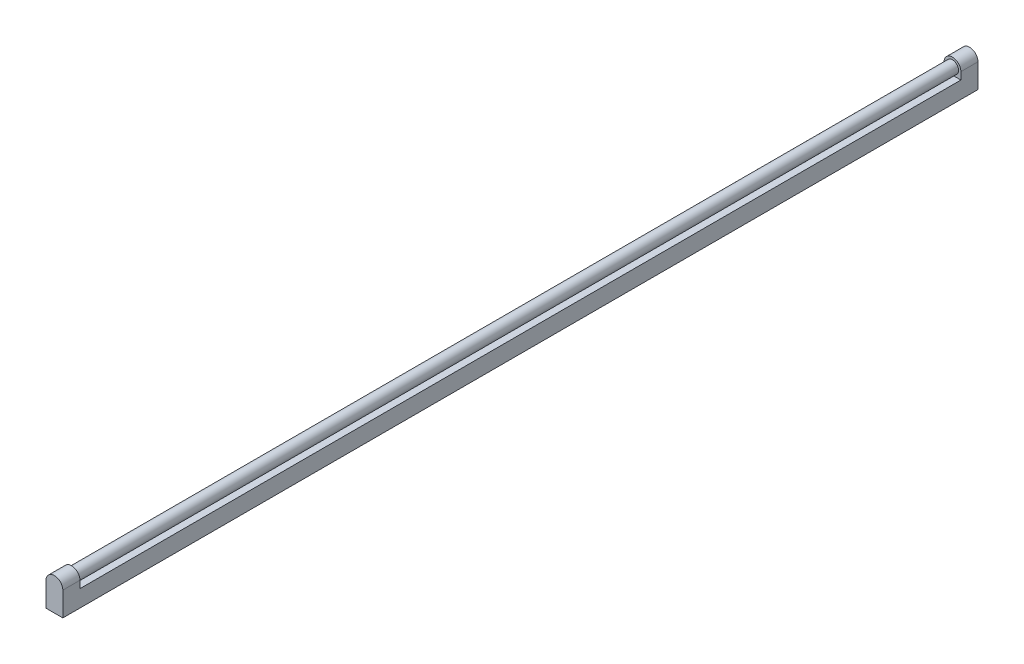
ISO-10303-21;
HEADER;
FILE_DESCRIPTION(('STEP AP214'),'2;1');
FILE_NAME('part.step','',(''),(''),'','','');
FILE_SCHEMA(('AUTOMOTIVE_DESIGN { 1 0 10303 214 1 1 1 1 }'));
ENDSEC;
DATA;
#1=APPLICATION_CONTEXT('core data for automotive mechanical design processes');
#2=APPLICATION_PROTOCOL_DEFINITION('international standard','automotive_design',2000,#1);
#3=PRODUCT_CONTEXT('',#1,'mechanical');
#4=PRODUCT('Part','Part','',(#3));
#5=PRODUCT_RELATED_PRODUCT_CATEGORY('part','',(#4));
#6=PRODUCT_DEFINITION_FORMATION('','',#4);
#7=PRODUCT_DEFINITION_CONTEXT('part definition',#1,'design');
#8=PRODUCT_DEFINITION('design','',#6,#7);
#9=PRODUCT_DEFINITION_SHAPE('','',#8);
#10=(LENGTH_UNIT() NAMED_UNIT(*) SI_UNIT(.MILLI.,.METRE.));
#11=(NAMED_UNIT(*) PLANE_ANGLE_UNIT() SI_UNIT($,.RADIAN.));
#12=(NAMED_UNIT(*) SI_UNIT($,.STERADIAN.) SOLID_ANGLE_UNIT());
#13=UNCERTAINTY_MEASURE_WITH_UNIT(LENGTH_MEASURE(1.E-05),#10,'distance_accuracy_value','');
#14=(GEOMETRIC_REPRESENTATION_CONTEXT(3) GLOBAL_UNCERTAINTY_ASSIGNED_CONTEXT((#13)) GLOBAL_UNIT_ASSIGNED_CONTEXT((#10,
#11,#12)) REPRESENTATION_CONTEXT('',''));
#15=CARTESIAN_POINT('',(0.,0.,0.));
#16=DIRECTION('',(0.,0.,1.));
#17=DIRECTION('',(1.,0.,0.));
#18=AXIS2_PLACEMENT_3D('',#15,#16,#17);
#19=CARTESIAN_POINT('',(0.,0.,0.));
#20=DIRECTION('',(0.,0.,1.));
#21=DIRECTION('',(1.,0.,0.));
#22=AXIS2_PLACEMENT_3D('',#19,#20,#21);
#23=PLANE('',#22);
#24=CARTESIAN_POINT('',(10.922,9.398,0.));
#25=DIRECTION('',(0.,0.,1.));
#26=DIRECTION('',(1.,0.,0.));
#27=AXIS2_PLACEMENT_3D('',#24,#25,#26);
#28=CIRCLE('',#27,7.9375);
#29=CARTESIAN_POINT('',(18.8595,9.398,0.));
#30=VERTEX_POINT('',#29);
#31=EDGE_CURVE('E11',#30,#30,#28,.F.);
#32=ORIENTED_EDGE('',*,*,#31,.F.);
#33=EDGE_LOOP('',(#32));
#34=FACE_BOUND('',#33,.T.);
#35=DIRECTION('',(1.,0.,0.));
#36=VECTOR('',#35,1.);
#37=CARTESIAN_POINT('',(21.844,0.,0.));
#38=LINE('',#37,#36);
#39=CARTESIAN_POINT('',(0.,0.,0.));
#40=VERTEX_POINT('',#39);
#41=CARTESIAN_POINT('',(21.844,0.,0.));
#42=VERTEX_POINT('',#41);
#43=EDGE_CURVE('E54',#40,#42,#38,.T.);
#44=ORIENTED_EDGE('',*,*,#43,.F.);
#45=DIRECTION('',(0.,1.,0.));
#46=VECTOR('',#45,1.);
#47=CARTESIAN_POINT('',(0.,0.,0.));
#48=LINE('',#47,#46);
#49=CARTESIAN_POINT('',(0.,9.398,0.));
#50=VERTEX_POINT('',#49);
#51=EDGE_CURVE('E76',#40,#50,#48,.T.);
#52=ORIENTED_EDGE('',*,*,#51,.T.);
#53=CARTESIAN_POINT('',(10.922,9.398,0.));
#54=DIRECTION('',(0.,0.,1.));
#55=DIRECTION('',(1.,0.,0.));
#56=AXIS2_PLACEMENT_3D('',#53,#54,#55);
#57=CIRCLE('',#56,10.922);
#58=CARTESIAN_POINT('',(21.844,9.398,0.));
#59=VERTEX_POINT('',#58);
#60=EDGE_CURVE('E164',#59,#50,#57,.T.);
#61=ORIENTED_EDGE('',*,*,#60,.F.);
#62=DIRECTION('',(0.,-1.,0.));
#63=VECTOR('',#62,1.);
#64=CARTESIAN_POINT('',(21.844,0.,0.));
#65=LINE('',#64,#63);
#66=EDGE_CURVE('E153',#59,#42,#65,.T.);
#67=ORIENTED_EDGE('',*,*,#66,.T.);
#68=EDGE_LOOP('',(#44,#52,#61,#67));
#69=FACE_BOUND('',#68,.T.);
#70=ADVANCED_FACE('F39',(#34,#69),#23,.F.);
#71=CARTESIAN_POINT('',(21.844,0.,22.225));
#72=DIRECTION('',(1.,0.,0.));
#73=DIRECTION('',(0.,1.,0.));
#74=AXIS2_PLACEMENT_3D('',#71,#72,#73);
#75=PLANE('',#74);
#76=ORIENTED_EDGE('',*,*,#66,.F.);
#77=DIRECTION('',(0.,0.,-1.));
#78=VECTOR('',#77,1.);
#79=CARTESIAN_POINT('',(21.844,9.398,22.225));
#80=LINE('',#79,#78);
#81=CARTESIAN_POINT('',(21.844,9.398,22.225));
#82=VERTEX_POINT('',#81);
#83=EDGE_CURVE('E47',#82,#59,#80,.T.);
#84=ORIENTED_EDGE('',*,*,#83,.F.);
#85=DIRECTION('',(0.,-1.,0.));
#86=VECTOR('',#85,1.);
#87=CARTESIAN_POINT('',(21.844,0.,22.225));
#88=LINE('',#87,#86);
#89=CARTESIAN_POINT('',(21.844,-21.844,22.225));
#90=VERTEX_POINT('',#89);
#91=EDGE_CURVE('E154',#82,#90,#88,.T.);
#92=ORIENTED_EDGE('',*,*,#91,.T.);
#93=DIRECTION('',(0.,0.,-1.));
#94=VECTOR('',#93,1.);
#95=CARTESIAN_POINT('',(21.844,-21.844,22.225));
#96=LINE('',#95,#94);
#97=CARTESIAN_POINT('',(21.844,-21.844,-1165.225));
#98=VERTEX_POINT('',#97);
#99=EDGE_CURVE('E63',#90,#98,#96,.T.);
#100=ORIENTED_EDGE('',*,*,#99,.T.);
#101=DIRECTION('',(0.,1.,0.));
#102=VECTOR('',#101,1.);
#103=CARTESIAN_POINT('',(21.844,0.,-1165.225));
#104=LINE('',#103,#102);
#105=CARTESIAN_POINT('',(21.844,9.398,-1165.225));
#106=VERTEX_POINT('',#105);
#107=EDGE_CURVE('E122',#98,#106,#104,.T.);
#108=ORIENTED_EDGE('',*,*,#107,.T.);
#109=DIRECTION('',(0.,0.,1.));
#110=VECTOR('',#109,1.);
#111=CARTESIAN_POINT('',(21.844,9.398,-1165.225));
#112=LINE('',#111,#110);
#113=CARTESIAN_POINT('',(21.844,9.398,-1143.));
#114=VERTEX_POINT('',#113);
#115=EDGE_CURVE('E118',#106,#114,#112,.T.);
#116=ORIENTED_EDGE('',*,*,#115,.T.);
#117=DIRECTION('',(0.,1.,0.));
#118=VECTOR('',#117,1.);
#119=CARTESIAN_POINT('',(21.844,0.,-1143.));
#120=LINE('',#119,#118);
#121=CARTESIAN_POINT('',(21.844,0.,-1143.));
#122=VERTEX_POINT('',#121);
#123=EDGE_CURVE('E130',#122,#114,#120,.T.);
#124=ORIENTED_EDGE('',*,*,#123,.F.);
#125=DIRECTION('',(0.,0.,1.));
#126=VECTOR('',#125,1.);
#127=CARTESIAN_POINT('',(21.844,0.,-571.5));
#128=LINE('',#127,#126);
#129=EDGE_CURVE('E147',#122,#42,#128,.T.);
#130=ORIENTED_EDGE('',*,*,#129,.T.);
#131=EDGE_LOOP('',(#76,#84,#92,#100,#108,#116,#124,#130));
#132=FACE_BOUND('',#131,.T.);
#133=ADVANCED_FACE('F41',(#132),#75,.T.);
#134=CARTESIAN_POINT('',(10.922,9.398,22.225));
#135=DIRECTION('',(0.,0.,-1.));
#136=DIRECTION('',(-1.,0.,0.));
#137=AXIS2_PLACEMENT_3D('',#134,#135,#136);
#138=CYLINDRICAL_SURFACE('',#137,10.922);
#139=ORIENTED_EDGE('',*,*,#60,.T.);
#140=DIRECTION('',(0.,0.,-1.));
#141=VECTOR('',#140,1.);
#142=CARTESIAN_POINT('',(0.,9.398,22.225));
#143=LINE('',#142,#141);
#144=CARTESIAN_POINT('',(0.,9.398,22.225));
#145=VERTEX_POINT('',#144);
#146=EDGE_CURVE('E171',#145,#50,#143,.T.);
#147=ORIENTED_EDGE('',*,*,#146,.F.);
#148=CARTESIAN_POINT('',(10.922,9.398,22.225));
#149=DIRECTION('',(0.,0.,1.));
#150=DIRECTION('',(1.,0.,0.));
#151=AXIS2_PLACEMENT_3D('',#148,#149,#150);
#152=CIRCLE('',#151,10.922);
#153=EDGE_CURVE('E156',#82,#145,#152,.T.);
#154=ORIENTED_EDGE('',*,*,#153,.F.);
#155=ORIENTED_EDGE('',*,*,#83,.T.);
#156=EDGE_LOOP('',(#139,#147,#154,#155));
#157=FACE_BOUND('',#156,.T.);
#158=ADVANCED_FACE('F173',(#157),#138,.T.);
#159=CARTESIAN_POINT('',(0.,0.,22.225));
#160=DIRECTION('',(-1.,0.,0.));
#161=DIRECTION('',(0.,-1.,0.));
#162=AXIS2_PLACEMENT_3D('',#159,#160,#161);
#163=PLANE('',#162);
#164=ORIENTED_EDGE('',*,*,#51,.F.);
#165=DIRECTION('',(0.,0.,1.));
#166=VECTOR('',#165,1.);
#167=CARTESIAN_POINT('',(0.,0.,-571.5));
#168=LINE('',#167,#166);
#169=CARTESIAN_POINT('',(0.,0.,-1143.));
#170=VERTEX_POINT('',#169);
#171=EDGE_CURVE('E150',#170,#40,#168,.T.);
#172=ORIENTED_EDGE('',*,*,#171,.F.);
#173=DIRECTION('',(0.,1.,0.));
#174=VECTOR('',#173,1.);
#175=CARTESIAN_POINT('',(0.,0.,-1143.));
#176=LINE('',#175,#174);
#177=CARTESIAN_POINT('',(0.,9.398,-1143.));
#178=VERTEX_POINT('',#177);
#179=EDGE_CURVE('E134',#170,#178,#176,.T.);
#180=ORIENTED_EDGE('',*,*,#179,.T.);
#181=DIRECTION('',(0.,0.,1.));
#182=VECTOR('',#181,1.);
#183=CARTESIAN_POINT('',(0.,9.398,-1165.225));
#184=LINE('',#183,#182);
#185=CARTESIAN_POINT('',(0.,9.398,-1165.225));
#186=VERTEX_POINT('',#185);
#187=EDGE_CURVE('E116',#186,#178,#184,.T.);
#188=ORIENTED_EDGE('',*,*,#187,.F.);
#189=DIRECTION('',(0.,1.,0.));
#190=VECTOR('',#189,1.);
#191=CARTESIAN_POINT('',(0.,0.,-1165.225));
#192=LINE('',#191,#190);
#193=CARTESIAN_POINT('',(0.,-21.844,-1165.225));
#194=VERTEX_POINT('',#193);
#195=EDGE_CURVE('E123',#194,#186,#192,.T.);
#196=ORIENTED_EDGE('',*,*,#195,.F.);
#197=DIRECTION('',(0.,0.,-1.));
#198=VECTOR('',#197,1.);
#199=CARTESIAN_POINT('',(0.,-21.844,22.225));
#200=LINE('',#199,#198);
#201=CARTESIAN_POINT('',(0.,-21.844,22.225));
#202=VERTEX_POINT('',#201);
#203=EDGE_CURVE('E169',#202,#194,#200,.T.);
#204=ORIENTED_EDGE('',*,*,#203,.F.);
#205=DIRECTION('',(0.,1.,0.));
#206=VECTOR('',#205,1.);
#207=CARTESIAN_POINT('',(0.,0.,22.225));
#208=LINE('',#207,#206);
#209=EDGE_CURVE('E158',#202,#145,#208,.T.);
#210=ORIENTED_EDGE('',*,*,#209,.T.);
#211=ORIENTED_EDGE('',*,*,#146,.T.);
#212=EDGE_LOOP('',(#164,#172,#180,#188,#196,#204,#210,#211));
#213=FACE_BOUND('',#212,.T.);
#214=ADVANCED_FACE('F132',(#213),#163,.T.);
#215=CARTESIAN_POINT('',(0.,-21.844,22.225));
#216=DIRECTION('',(0.,-1.,0.));
#217=DIRECTION('',(1.,0.,0.));
#218=AXIS2_PLACEMENT_3D('',#215,#216,#217);
#219=PLANE('',#218);
#220=ORIENTED_EDGE('',*,*,#203,.T.);
#221=DIRECTION('',(-1.,0.,0.));
#222=VECTOR('',#221,1.);
#223=CARTESIAN_POINT('',(0.,-21.844,-1165.225));
#224=LINE('',#223,#222);
#225=EDGE_CURVE('E128',#98,#194,#224,.T.);
#226=ORIENTED_EDGE('',*,*,#225,.F.);
#227=ORIENTED_EDGE('',*,*,#99,.F.);
#228=DIRECTION('',(-1.,0.,0.));
#229=VECTOR('',#228,1.);
#230=CARTESIAN_POINT('',(0.,-21.844,22.225));
#231=LINE('',#230,#229);
#232=EDGE_CURVE('E161',#90,#202,#231,.T.);
#233=ORIENTED_EDGE('',*,*,#232,.T.);
#234=EDGE_LOOP('',(#220,#226,#227,#233));
#235=FACE_BOUND('',#234,.T.);
#236=ADVANCED_FACE('F188',(#235),#219,.T.);
#237=CARTESIAN_POINT('',(0.,0.,22.225));
#238=DIRECTION('',(0.,0.,1.));
#239=DIRECTION('',(1.,0.,0.));
#240=AXIS2_PLACEMENT_3D('',#237,#238,#239);
#241=PLANE('',#240);
#242=ORIENTED_EDGE('',*,*,#91,.F.);
#243=ORIENTED_EDGE('',*,*,#153,.T.);
#244=ORIENTED_EDGE('',*,*,#209,.F.);
#245=ORIENTED_EDGE('',*,*,#232,.F.);
#246=EDGE_LOOP('',(#242,#243,#244,#245));
#247=FACE_BOUND('',#246,.T.);
#248=ADVANCED_FACE('F191',(#247),#241,.T.);
#249=CARTESIAN_POINT('',(21.844,0.,-571.5));
#250=DIRECTION('',(0.,-1.,0.));
#251=DIRECTION('',(0.,0.,-1.));
#252=AXIS2_PLACEMENT_3D('',#249,#250,#251);
#253=PLANE('',#252);
#254=ORIENTED_EDGE('',*,*,#43,.T.);
#255=ORIENTED_EDGE('',*,*,#129,.F.);
#256=DIRECTION('',(1.,0.,0.));
#257=VECTOR('',#256,1.);
#258=CARTESIAN_POINT('',(21.844,0.,-1143.));
#259=LINE('',#258,#257);
#260=EDGE_CURVE('E139',#170,#122,#259,.T.);
#261=ORIENTED_EDGE('',*,*,#260,.F.);
#262=ORIENTED_EDGE('',*,*,#171,.T.);
#263=EDGE_LOOP('',(#254,#255,#261,#262));
#264=FACE_BOUND('',#263,.T.);
#265=ADVANCED_FACE('F179',(#264),#253,.F.);
#266=CARTESIAN_POINT('',(10.922,9.398,-571.5));
#267=DIRECTION('',(0.,0.,1.));
#268=DIRECTION('',(1.,0.,0.));
#269=AXIS2_PLACEMENT_3D('',#266,#267,#268);
#270=CYLINDRICAL_SURFACE('',#269,7.9375);
#271=ORIENTED_EDGE('',*,*,#31,.T.);
#272=EDGE_LOOP('',(#271));
#273=FACE_BOUND('',#272,.T.);
#274=CARTESIAN_POINT('',(10.922,9.398,-1143.));
#275=DIRECTION('',(0.,0.,-1.));
#276=DIRECTION('',(-1.,0.,0.));
#277=AXIS2_PLACEMENT_3D('',#274,#275,#276);
#278=CIRCLE('',#277,7.9375);
#279=CARTESIAN_POINT('',(2.9845,9.398,-1143.));
#280=VERTEX_POINT('',#279);
#281=EDGE_CURVE('E136',#280,#280,#278,.T.);
#282=ORIENTED_EDGE('',*,*,#281,.F.);
#283=EDGE_LOOP('',(#282));
#284=FACE_BOUND('',#283,.T.);
#285=ADVANCED_FACE('F198',(#273,#284),#270,.T.);
#286=CARTESIAN_POINT('',(10.922,9.398,-1165.225));
#287=DIRECTION('',(0.,0.,1.));
#288=DIRECTION('',(1.,0.,0.));
#289=AXIS2_PLACEMENT_3D('',#286,#287,#288);
#290=CYLINDRICAL_SURFACE('',#289,10.922);
#291=CARTESIAN_POINT('',(10.922,9.398,-1143.));
#292=DIRECTION('',(0.,0.,-1.));
#293=DIRECTION('',(-1.,0.,0.));
#294=AXIS2_PLACEMENT_3D('',#291,#292,#293);
#295=CIRCLE('',#294,10.922);
#296=EDGE_CURVE('E182',#178,#114,#295,.T.);
#297=ORIENTED_EDGE('',*,*,#296,.T.);
#298=ORIENTED_EDGE('',*,*,#115,.F.);
#299=CARTESIAN_POINT('',(10.922,9.398,-1165.225));
#300=DIRECTION('',(0.,0.,-1.));
#301=DIRECTION('',(-1.,0.,0.));
#302=AXIS2_PLACEMENT_3D('',#299,#300,#301);
#303=CIRCLE('',#302,10.922);
#304=EDGE_CURVE('E111',#186,#106,#303,.T.);
#305=ORIENTED_EDGE('',*,*,#304,.F.);
#306=ORIENTED_EDGE('',*,*,#187,.T.);
#307=EDGE_LOOP('',(#297,#298,#305,#306));
#308=FACE_BOUND('',#307,.T.);
#309=ADVANCED_FACE('F114',(#308),#290,.T.);
#310=CARTESIAN_POINT('',(0.,0.,-1165.225));
#311=DIRECTION('',(0.,0.,-1.));
#312=DIRECTION('',(-1.,0.,0.));
#313=AXIS2_PLACEMENT_3D('',#310,#311,#312);
#314=PLANE('',#313);
#315=ORIENTED_EDGE('',*,*,#195,.T.);
#316=ORIENTED_EDGE('',*,*,#304,.T.);
#317=ORIENTED_EDGE('',*,*,#107,.F.);
#318=ORIENTED_EDGE('',*,*,#225,.T.);
#319=EDGE_LOOP('',(#315,#316,#317,#318));
#320=FACE_BOUND('',#319,.T.);
#321=ADVANCED_FACE('F127',(#320),#314,.T.);
#322=CARTESIAN_POINT('',(0.,0.,-1143.));
#323=DIRECTION('',(0.,0.,-1.));
#324=DIRECTION('',(-1.,0.,0.));
#325=AXIS2_PLACEMENT_3D('',#322,#323,#324);
#326=PLANE('',#325);
#327=ORIENTED_EDGE('',*,*,#281,.T.);
#328=EDGE_LOOP('',(#327));
#329=FACE_BOUND('',#328,.T.);
#330=ORIENTED_EDGE('',*,*,#179,.F.);
#331=ORIENTED_EDGE('',*,*,#260,.T.);
#332=ORIENTED_EDGE('',*,*,#123,.T.);
#333=ORIENTED_EDGE('',*,*,#296,.F.);
#334=EDGE_LOOP('',(#330,#331,#332,#333));
#335=FACE_BOUND('',#334,.T.);
#336=ADVANCED_FACE('F181',(#329,#335),#326,.F.);
#337=CLOSED_SHELL('',(#70,#133,#158,#214,#236,#248,#265,#285,#309,#321,#336));
#338=MANIFOLD_SOLID_BREP('B2',#337);
#339=ADVANCED_BREP_SHAPE_REPRESENTATION('',(#18,#338),#14);
#340=SHAPE_DEFINITION_REPRESENTATION(#9,#339);
ENDSEC;
END-ISO-10303-21;
